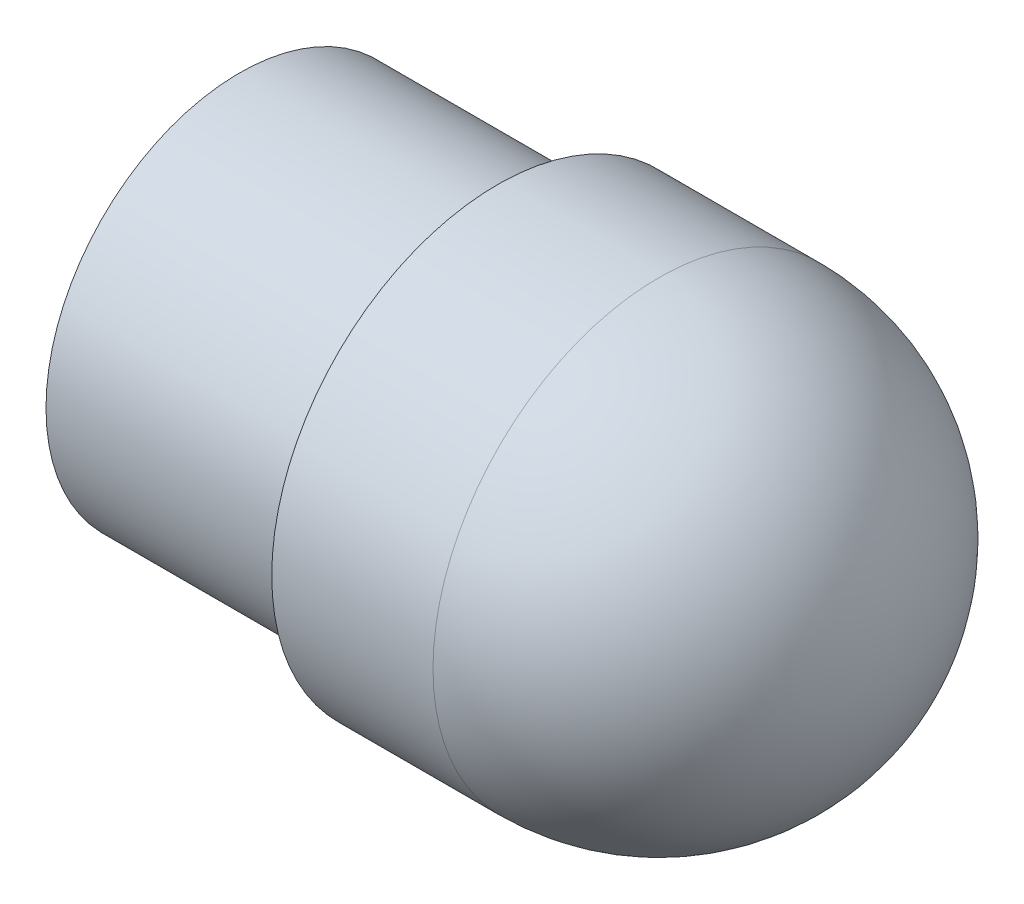
ISO-10303-21;
HEADER;
FILE_DESCRIPTION(('STEP AP214'),'2;1');
FILE_NAME('part.step','',(''),(''),'','','');
FILE_SCHEMA(('AUTOMOTIVE_DESIGN { 1 0 10303 214 1 1 1 1 }'));
ENDSEC;
DATA;
#1=APPLICATION_CONTEXT('core data for automotive mechanical design processes');
#2=APPLICATION_PROTOCOL_DEFINITION('international standard','automotive_design',2000,#1);
#3=PRODUCT_CONTEXT('',#1,'mechanical');
#4=PRODUCT('Part','Part','',(#3));
#5=PRODUCT_RELATED_PRODUCT_CATEGORY('part','',(#4));
#6=PRODUCT_DEFINITION_FORMATION('','',#4);
#7=PRODUCT_DEFINITION_CONTEXT('part definition',#1,'design');
#8=PRODUCT_DEFINITION('design','',#6,#7);
#9=PRODUCT_DEFINITION_SHAPE('','',#8);
#10=(LENGTH_UNIT() NAMED_UNIT(*) SI_UNIT(.MILLI.,.METRE.));
#11=(NAMED_UNIT(*) PLANE_ANGLE_UNIT() SI_UNIT($,.RADIAN.));
#12=(NAMED_UNIT(*) SI_UNIT($,.STERADIAN.) SOLID_ANGLE_UNIT());
#13=UNCERTAINTY_MEASURE_WITH_UNIT(LENGTH_MEASURE(1.E-05),#10,'distance_accuracy_value','');
#14=(GEOMETRIC_REPRESENTATION_CONTEXT(3) GLOBAL_UNCERTAINTY_ASSIGNED_CONTEXT((#13)) GLOBAL_UNIT_ASSIGNED_CONTEXT((#10,
#11,#12)) REPRESENTATION_CONTEXT('',''));
#15=CARTESIAN_POINT('',(0.,0.,0.));
#16=DIRECTION('',(0.,0.,1.));
#17=DIRECTION('',(1.,0.,0.));
#18=AXIS2_PLACEMENT_3D('',#15,#16,#17);
#19=CARTESIAN_POINT('',(-59.5059583486398,0.,0.));
#20=DIRECTION('',(-1.,0.,0.));
#21=DIRECTION('',(0.,0.,1.));
#22=AXIS2_PLACEMENT_3D('',#19,#20,#21);
#23=CYLINDRICAL_SURFACE('',#22,150.);
#24=CARTESIAN_POINT('',(172.852391375776,0.,0.));
#25=DIRECTION('',(-1.,0.,0.));
#26=DIRECTION('',(0.,0.,1.));
#27=AXIS2_PLACEMENT_3D('',#24,#25,#26);
#28=CIRCLE('',#27,150.);
#29=CARTESIAN_POINT('',(172.852391375776,0.,150.));
#30=VERTEX_POINT('',#29);
#31=EDGE_CURVE('E10',#30,#30,#28,.T.);
#32=ORIENTED_EDGE('',*,*,#31,.T.);
#33=EDGE_LOOP('',(#32));
#34=FACE_BOUND('',#33,.T.);
#35=CARTESIAN_POINT('',(-27.1476086242241,0.,0.));
#36=DIRECTION('',(-1.,0.,0.));
#37=DIRECTION('',(0.,0.,1.));
#38=AXIS2_PLACEMENT_3D('',#35,#36,#37);
#39=CIRCLE('',#38,150.);
#40=CARTESIAN_POINT('',(-27.1476086242241,0.,150.));
#41=VERTEX_POINT('',#40);
#42=EDGE_CURVE('E54',#41,#41,#39,.T.);
#43=ORIENTED_EDGE('',*,*,#42,.F.);
#44=EDGE_LOOP('',(#43));
#45=FACE_BOUND('',#44,.T.);
#46=ADVANCED_FACE('F37',(#34,#45),#23,.T.);
#47=CARTESIAN_POINT('',(172.852391375776,0.,0.));
#48=DIRECTION('',(1.,0.,0.));
#49=DIRECTION('',(0.,0.,-1.));
#50=AXIS2_PLACEMENT_3D('',#47,#48,#49);
#51=PLANE('',#50);
#52=ORIENTED_EDGE('',*,*,#31,.F.);
#53=EDGE_LOOP('',(#52));
#54=FACE_BOUND('',#53,.T.);
#55=CARTESIAN_POINT('',(172.852391375776,0.,0.));
#56=DIRECTION('',(-1.,0.,0.));
#57=DIRECTION('',(0.,0.,1.));
#58=AXIS2_PLACEMENT_3D('',#55,#56,#57);
#59=CIRCLE('',#58,175.);
#60=CARTESIAN_POINT('',(172.852391375776,0.,175.));
#61=VERTEX_POINT('',#60);
#62=EDGE_CURVE('E44',#61,#61,#59,.T.);
#63=ORIENTED_EDGE('',*,*,#62,.T.);
#64=EDGE_LOOP('',(#63));
#65=FACE_BOUND('',#64,.T.);
#66=ADVANCED_FACE('F64',(#54,#65),#51,.F.);
#67=CARTESIAN_POINT('',(-59.5059583486398,0.,0.));
#68=DIRECTION('',(-1.,0.,0.));
#69=DIRECTION('',(0.,0.,1.));
#70=AXIS2_PLACEMENT_3D('',#67,#68,#69);
#71=CYLINDRICAL_SURFACE('',#70,175.);
#72=CARTESIAN_POINT('',(297.852391375776,0.,0.));
#73=DIRECTION('',(-1.,0.,0.));
#74=DIRECTION('',(0.,0.,1.));
#75=AXIS2_PLACEMENT_3D('',#72,#73,#74);
#76=CIRCLE('',#75,175.);
#77=CARTESIAN_POINT('',(297.852391375776,0.,175.));
#78=VERTEX_POINT('',#77);
#79=EDGE_CURVE('E49',#78,#78,#76,.T.);
#80=ORIENTED_EDGE('',*,*,#79,.T.);
#81=EDGE_LOOP('',(#80));
#82=FACE_BOUND('',#81,.T.);
#83=ORIENTED_EDGE('',*,*,#62,.F.);
#84=EDGE_LOOP('',(#83));
#85=FACE_BOUND('',#84,.T.);
#86=ADVANCED_FACE('F68',(#82,#85),#71,.T.);
#87=CARTESIAN_POINT('',(297.852391375776,0.,0.));
#88=DIRECTION('',(-1.,0.,0.));
#89=DIRECTION('',(0.,-1.,0.));
#90=AXIS2_PLACEMENT_3D('',#87,#88,#89);
#91=SPHERICAL_SURFACE('',#90,175.);
#92=ORIENTED_EDGE('',*,*,#79,.F.);
#93=EDGE_LOOP('',(#92));
#94=FACE_BOUND('',#93,.T.);
#95=ADVANCED_FACE('F73',(#94),#91,.T.);
#96=CARTESIAN_POINT('',(-27.1476086242241,0.,0.));
#97=DIRECTION('',(-1.,0.,0.));
#98=DIRECTION('',(0.,0.,1.));
#99=AXIS2_PLACEMENT_3D('',#96,#97,#98);
#100=PLANE('',#99);
#101=ORIENTED_EDGE('',*,*,#42,.T.);
#102=EDGE_LOOP('',(#101));
#103=FACE_BOUND('',#102,.T.);
#104=ADVANCED_FACE('F61',(#103),#100,.T.);
#105=CLOSED_SHELL('',(#46,#66,#86,#95,#104));
#106=MANIFOLD_SOLID_BREP('B2',#105);
#107=ADVANCED_BREP_SHAPE_REPRESENTATION('',(#18,#106),#14);
#108=SHAPE_DEFINITION_REPRESENTATION(#9,#107);
ENDSEC;
END-ISO-10303-21;
